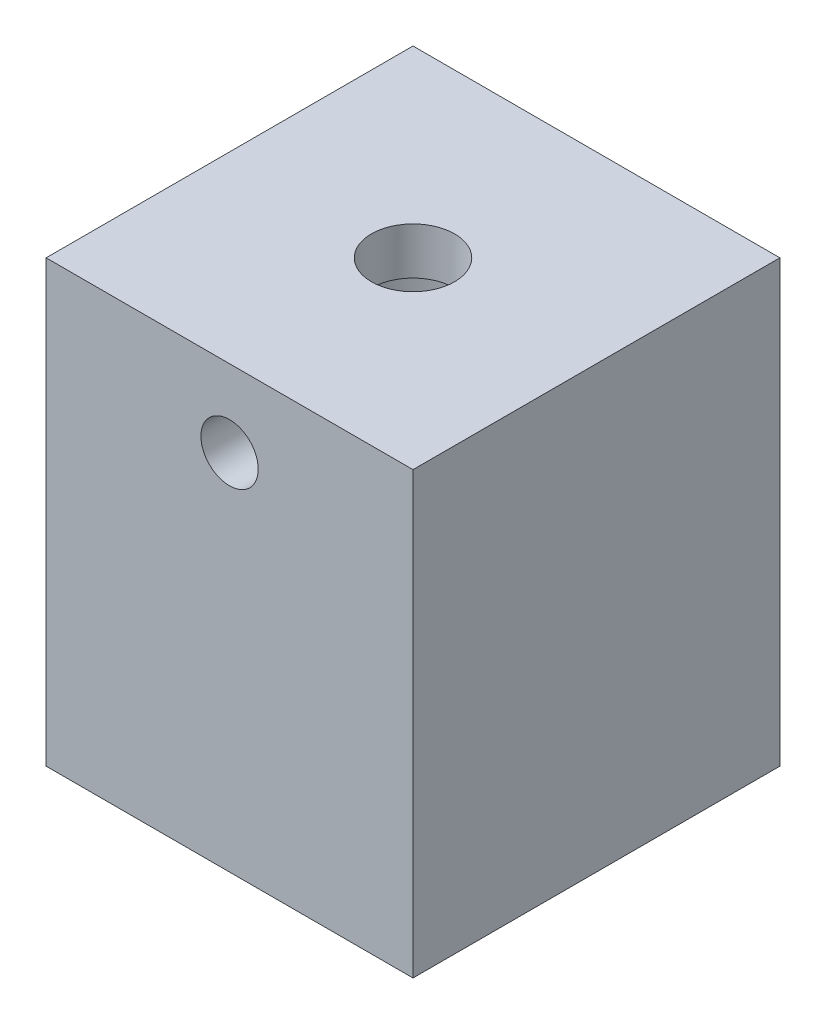
ISO-10303-21;
HEADER;
FILE_DESCRIPTION(('STEP AP214'),'2;1');
FILE_NAME('part.step','',(''),(''),'','','');
FILE_SCHEMA(('AUTOMOTIVE_DESIGN { 1 0 10303 214 1 1 1 1 }'));
ENDSEC;
DATA;
#1=APPLICATION_CONTEXT('core data for automotive mechanical design processes');
#2=APPLICATION_PROTOCOL_DEFINITION('international standard','automotive_design',2000,#1);
#3=PRODUCT_CONTEXT('',#1,'mechanical');
#4=PRODUCT('Part','Part','',(#3));
#5=PRODUCT_RELATED_PRODUCT_CATEGORY('part','',(#4));
#6=PRODUCT_DEFINITION_FORMATION('','',#4);
#7=PRODUCT_DEFINITION_CONTEXT('part definition',#1,'design');
#8=PRODUCT_DEFINITION('design','',#6,#7);
#9=PRODUCT_DEFINITION_SHAPE('','',#8);
#10=(LENGTH_UNIT() NAMED_UNIT(*) SI_UNIT(.MILLI.,.METRE.));
#11=(NAMED_UNIT(*) PLANE_ANGLE_UNIT() SI_UNIT($,.RADIAN.));
#12=(NAMED_UNIT(*) SI_UNIT($,.STERADIAN.) SOLID_ANGLE_UNIT());
#13=UNCERTAINTY_MEASURE_WITH_UNIT(LENGTH_MEASURE(1.E-05),#10,'distance_accuracy_value','');
#14=(GEOMETRIC_REPRESENTATION_CONTEXT(3) GLOBAL_UNCERTAINTY_ASSIGNED_CONTEXT((#13)) GLOBAL_UNIT_ASSIGNED_CONTEXT((#10,
#11,#12)) REPRESENTATION_CONTEXT('',''));
#15=CARTESIAN_POINT('',(0.,0.,0.));
#16=DIRECTION('',(0.,0.,1.));
#17=DIRECTION('',(1.,0.,0.));
#18=AXIS2_PLACEMENT_3D('',#15,#16,#17);
#19=CARTESIAN_POINT('',(25.4,60.96,25.4));
#20=DIRECTION('',(-1.,0.,0.));
#21=DIRECTION('',(0.,0.,1.));
#22=AXIS2_PLACEMENT_3D('',#19,#20,#21);
#23=PLANE('',#22);
#24=DIRECTION('',(0.,0.,-1.));
#25=VECTOR('',#24,1.);
#26=CARTESIAN_POINT('',(25.4,0.,25.4));
#27=LINE('',#26,#25);
#28=CARTESIAN_POINT('',(25.4,0.,25.4));
#29=VERTEX_POINT('',#28);
#30=CARTESIAN_POINT('',(25.4,0.,-25.4));
#31=VERTEX_POINT('',#30);
#32=EDGE_CURVE('E115',#29,#31,#27,.T.);
#33=ORIENTED_EDGE('',*,*,#32,.T.);
#34=DIRECTION('',(0.,-1.,0.));
#35=VECTOR('',#34,1.);
#36=CARTESIAN_POINT('',(25.4,60.96,-25.4));
#37=LINE('',#36,#35);
#38=CARTESIAN_POINT('',(25.4,60.96,-25.4));
#39=VERTEX_POINT('',#38);
#40=EDGE_CURVE('E103',#39,#31,#37,.T.);
#41=ORIENTED_EDGE('',*,*,#40,.F.);
#42=DIRECTION('',(0.,0.,-1.));
#43=VECTOR('',#42,1.);
#44=CARTESIAN_POINT('',(25.4,60.96,25.4));
#45=LINE('',#44,#43);
#46=CARTESIAN_POINT('',(25.4,60.96,25.4));
#47=VERTEX_POINT('',#46);
#48=EDGE_CURVE('E121',#47,#39,#45,.T.);
#49=ORIENTED_EDGE('',*,*,#48,.F.);
#50=DIRECTION('',(0.,-1.,0.));
#51=VECTOR('',#50,1.);
#52=CARTESIAN_POINT('',(25.4,60.96,25.4));
#53=LINE('',#52,#51);
#54=EDGE_CURVE('E131',#47,#29,#53,.T.);
#55=ORIENTED_EDGE('',*,*,#54,.T.);
#56=EDGE_LOOP('',(#33,#41,#49,#55));
#57=FACE_BOUND('',#56,.T.);
#58=ADVANCED_FACE('F33',(#57),#23,.F.);
#59=CARTESIAN_POINT('',(-25.4,60.96,-25.4));
#60=DIRECTION('',(0.,0.,1.));
#61=DIRECTION('',(1.,0.,0.));
#62=AXIS2_PLACEMENT_3D('',#59,#60,#61);
#63=PLANE('',#62);
#64=CARTESIAN_POINT('',(0.,50.292,-25.4));
#65=DIRECTION('',(0.,0.,1.));
#66=DIRECTION('',(1.,0.,0.));
#67=AXIS2_PLACEMENT_3D('',#64,#65,#66);
#68=CIRCLE('',#67,3.96874999999999);
#69=CARTESIAN_POINT('',(3.96874999999999,50.292,-25.4));
#70=VERTEX_POINT('',#69);
#71=EDGE_CURVE('E110',#70,#70,#68,.T.);
#72=ORIENTED_EDGE('',*,*,#71,.T.);
#73=EDGE_LOOP('',(#72));
#74=FACE_BOUND('',#73,.T.);
#75=DIRECTION('',(-1.,0.,0.));
#76=VECTOR('',#75,1.);
#77=CARTESIAN_POINT('',(-25.4,0.,-25.4));
#78=LINE('',#77,#76);
#79=CARTESIAN_POINT('',(-25.4,0.,-25.4));
#80=VERTEX_POINT('',#79);
#81=EDGE_CURVE('E134',#31,#80,#78,.T.);
#82=ORIENTED_EDGE('',*,*,#81,.T.);
#83=DIRECTION('',(0.,-1.,0.));
#84=VECTOR('',#83,1.);
#85=CARTESIAN_POINT('',(-25.4,60.96,-25.4));
#86=LINE('',#85,#84);
#87=CARTESIAN_POINT('',(-25.4,60.96,-25.4));
#88=VERTEX_POINT('',#87);
#89=EDGE_CURVE('E144',#88,#80,#86,.T.);
#90=ORIENTED_EDGE('',*,*,#89,.F.);
#91=DIRECTION('',(-1.,0.,0.));
#92=VECTOR('',#91,1.);
#93=CARTESIAN_POINT('',(-25.4,60.96,-25.4));
#94=LINE('',#93,#92);
#95=EDGE_CURVE('E124',#39,#88,#94,.T.);
#96=ORIENTED_EDGE('',*,*,#95,.F.);
#97=ORIENTED_EDGE('',*,*,#40,.T.);
#98=EDGE_LOOP('',(#82,#90,#96,#97));
#99=FACE_BOUND('',#98,.T.);
#100=ADVANCED_FACE('F214',(#74,#99),#63,.F.);
#101=CARTESIAN_POINT('',(-25.4,60.96,25.4));
#102=DIRECTION('',(1.,0.,0.));
#103=DIRECTION('',(0.,0.,-1.));
#104=AXIS2_PLACEMENT_3D('',#101,#102,#103);
#105=PLANE('',#104);
#106=DIRECTION('',(0.,0.,1.));
#107=VECTOR('',#106,1.);
#108=CARTESIAN_POINT('',(-25.4,0.,25.4));
#109=LINE('',#108,#107);
#110=CARTESIAN_POINT('',(-25.4,0.,25.4));
#111=VERTEX_POINT('',#110);
#112=EDGE_CURVE('E136',#80,#111,#109,.T.);
#113=ORIENTED_EDGE('',*,*,#112,.T.);
#114=DIRECTION('',(0.,-1.,0.));
#115=VECTOR('',#114,1.);
#116=CARTESIAN_POINT('',(-25.4,60.96,25.4));
#117=LINE('',#116,#115);
#118=CARTESIAN_POINT('',(-25.4,60.96,25.4));
#119=VERTEX_POINT('',#118);
#120=EDGE_CURVE('E141',#119,#111,#117,.T.);
#121=ORIENTED_EDGE('',*,*,#120,.F.);
#122=DIRECTION('',(0.,0.,1.));
#123=VECTOR('',#122,1.);
#124=CARTESIAN_POINT('',(-25.4,60.96,25.4));
#125=LINE('',#124,#123);
#126=EDGE_CURVE('E127',#88,#119,#125,.T.);
#127=ORIENTED_EDGE('',*,*,#126,.F.);
#128=ORIENTED_EDGE('',*,*,#89,.T.);
#129=EDGE_LOOP('',(#113,#121,#127,#128));
#130=FACE_BOUND('',#129,.T.);
#131=ADVANCED_FACE('F219',(#130),#105,.F.);
#132=CARTESIAN_POINT('',(-25.4,60.96,25.4));
#133=DIRECTION('',(0.,0.,-1.));
#134=DIRECTION('',(-1.,0.,0.));
#135=AXIS2_PLACEMENT_3D('',#132,#133,#134);
#136=PLANE('',#135);
#137=CARTESIAN_POINT('',(0.,50.292,25.4));
#138=DIRECTION('',(0.,0.,1.));
#139=DIRECTION('',(1.,0.,0.));
#140=AXIS2_PLACEMENT_3D('',#137,#138,#139);
#141=CIRCLE('',#140,3.96874999999999);
#142=CARTESIAN_POINT('',(3.96874999999999,50.292,25.4));
#143=VERTEX_POINT('',#142);
#144=EDGE_CURVE('E415',#143,#143,#141,.T.);
#145=ORIENTED_EDGE('',*,*,#144,.F.);
#146=EDGE_LOOP('',(#145));
#147=FACE_BOUND('',#146,.T.);
#148=DIRECTION('',(1.,0.,0.));
#149=VECTOR('',#148,1.);
#150=CARTESIAN_POINT('',(-25.4,0.,25.4));
#151=LINE('',#150,#149);
#152=EDGE_CURVE('E125',#111,#29,#151,.T.);
#153=ORIENTED_EDGE('',*,*,#152,.T.);
#154=ORIENTED_EDGE('',*,*,#54,.F.);
#155=DIRECTION('',(1.,0.,0.));
#156=VECTOR('',#155,1.);
#157=CARTESIAN_POINT('',(-25.4,60.96,25.4));
#158=LINE('',#157,#156);
#159=EDGE_CURVE('E129',#119,#47,#158,.T.);
#160=ORIENTED_EDGE('',*,*,#159,.F.);
#161=ORIENTED_EDGE('',*,*,#120,.T.);
#162=EDGE_LOOP('',(#153,#154,#160,#161));
#163=FACE_BOUND('',#162,.T.);
#164=ADVANCED_FACE('F237',(#147,#163),#136,.F.);
#165=CARTESIAN_POINT('',(0.,60.96,0.));
#166=DIRECTION('',(0.,-1.,0.));
#167=DIRECTION('',(0.,0.,-1.));
#168=AXIS2_PLACEMENT_3D('',#165,#166,#167);
#169=PLANE('',#168);
#170=CARTESIAN_POINT('',(0.,60.96,0.));
#171=DIRECTION('',(0.,1.,0.));
#172=DIRECTION('',(0.,0.,1.));
#173=AXIS2_PLACEMENT_3D('',#170,#171,#172);
#174=CIRCLE('',#173,5.75436999999999);
#175=CARTESIAN_POINT('',(0.,60.96,5.75436999999999));
#176=VERTEX_POINT('',#175);
#177=EDGE_CURVE('E255',#176,#176,#174,.T.);
#178=ORIENTED_EDGE('',*,*,#177,.F.);
#179=EDGE_LOOP('',(#178));
#180=FACE_BOUND('',#179,.T.);
#181=ORIENTED_EDGE('',*,*,#48,.T.);
#182=ORIENTED_EDGE('',*,*,#95,.T.);
#183=ORIENTED_EDGE('',*,*,#126,.T.);
#184=ORIENTED_EDGE('',*,*,#159,.T.);
#185=EDGE_LOOP('',(#181,#182,#183,#184));
#186=FACE_BOUND('',#185,.T.);
#187=ADVANCED_FACE('F233',(#180,#186),#169,.F.);
#188=CARTESIAN_POINT('',(0.,0.,0.));
#189=DIRECTION('',(0.,-1.,0.));
#190=DIRECTION('',(0.,0.,-1.));
#191=AXIS2_PLACEMENT_3D('',#188,#189,#190);
#192=PLANE('',#191);
#193=CARTESIAN_POINT('',(-11.1125,0.,-12.7));
#194=DIRECTION('',(0.,-1.,0.));
#195=DIRECTION('',(0.,0.,-1.));
#196=AXIS2_PLACEMENT_3D('',#193,#194,#195);
#197=CIRCLE('',#196,2.01929999999999);
#198=CARTESIAN_POINT('',(-11.1125,0.,-14.7193));
#199=VERTEX_POINT('',#198);
#200=EDGE_CURVE('E279',#199,#199,#197,.T.);
#201=ORIENTED_EDGE('',*,*,#200,.F.);
#202=EDGE_LOOP('',(#201));
#203=FACE_BOUND('',#202,.T.);
#204=CARTESIAN_POINT('',(-11.1125,0.,12.7));
#205=DIRECTION('',(0.,-1.,0.));
#206=DIRECTION('',(0.,0.,-1.));
#207=AXIS2_PLACEMENT_3D('',#204,#205,#206);
#208=CIRCLE('',#207,2.01929999999999);
#209=CARTESIAN_POINT('',(-11.1125,0.,10.6807));
#210=VERTEX_POINT('',#209);
#211=EDGE_CURVE('E274',#210,#210,#208,.T.);
#212=ORIENTED_EDGE('',*,*,#211,.F.);
#213=EDGE_LOOP('',(#212));
#214=FACE_BOUND('',#213,.T.);
#215=CARTESIAN_POINT('',(11.1125,0.,12.7));
#216=DIRECTION('',(0.,-1.,0.));
#217=DIRECTION('',(0.,0.,-1.));
#218=AXIS2_PLACEMENT_3D('',#215,#216,#217);
#219=CIRCLE('',#218,2.01929999999999);
#220=CARTESIAN_POINT('',(11.1125,0.,10.6807));
#221=VERTEX_POINT('',#220);
#222=EDGE_CURVE('E268',#221,#221,#219,.T.);
#223=ORIENTED_EDGE('',*,*,#222,.F.);
#224=EDGE_LOOP('',(#223));
#225=FACE_BOUND('',#224,.T.);
#226=CARTESIAN_POINT('',(11.1125,0.,-12.7));
#227=DIRECTION('',(0.,-1.,0.));
#228=DIRECTION('',(0.,0.,-1.));
#229=AXIS2_PLACEMENT_3D('',#226,#227,#228);
#230=CIRCLE('',#229,2.01929999999999);
#231=CARTESIAN_POINT('',(11.1125,0.,-14.7193));
#232=VERTEX_POINT('',#231);
#233=EDGE_CURVE('E260',#232,#232,#230,.T.);
#234=ORIENTED_EDGE('',*,*,#233,.F.);
#235=EDGE_LOOP('',(#234));
#236=FACE_BOUND('',#235,.T.);
#237=CARTESIAN_POINT('',(0.,0.,0.));
#238=DIRECTION('',(0.,-1.,0.));
#239=DIRECTION('',(0.,0.,-1.));
#240=AXIS2_PLACEMENT_3D('',#237,#238,#239);
#241=CIRCLE('',#240,12.7);
#242=CARTESIAN_POINT('',(0.,0.,-12.7));
#243=VERTEX_POINT('',#242);
#244=EDGE_CURVE('E113',#243,#243,#241,.T.);
#245=ORIENTED_EDGE('',*,*,#244,.F.);
#246=EDGE_LOOP('',(#245));
#247=FACE_BOUND('',#246,.T.);
#248=ORIENTED_EDGE('',*,*,#32,.F.);
#249=ORIENTED_EDGE('',*,*,#152,.F.);
#250=ORIENTED_EDGE('',*,*,#112,.F.);
#251=ORIENTED_EDGE('',*,*,#81,.F.);
#252=EDGE_LOOP('',(#248,#249,#250,#251));
#253=FACE_BOUND('',#252,.T.);
#254=ADVANCED_FACE('F227',(#203,#214,#225,#236,#247,#253),#192,.T.);
#255=CARTESIAN_POINT('',(0.,50.292,0.));
#256=DIRECTION('',(0.,-1.,0.));
#257=DIRECTION('',(0.,0.,-1.));
#258=AXIS2_PLACEMENT_3D('',#255,#256,#257);
#259=CONICAL_SURFACE('',#258,12.7,1.02974425867665);
#260=CARTESIAN_POINT('',(0.,54.4653555413364,0.));
#261=DIRECTION('',(0.,-1.,0.));
#262=DIRECTION('',(0.,0.,-1.));
#263=AXIS2_PLACEMENT_3D('',#260,#261,#262);
#264=CIRCLE('',#263,5.75436999999999);
#265=CARTESIAN_POINT('',(0.,54.4653555413364,-5.75436999999999));
#266=VERTEX_POINT('',#265);
#267=EDGE_CURVE('E117',#266,#266,#264,.F.);
#268=ORIENTED_EDGE('',*,*,#267,.T.);
#269=EDGE_LOOP('',(#268));
#270=FACE_BOUND('',#269,.T.);
#271=CARTESIAN_POINT('',(0.,50.292,0.));
#272=DIRECTION('',(0.,-1.,0.));
#273=DIRECTION('',(0.,0.,-1.));
#274=AXIS2_PLACEMENT_3D('',#271,#272,#273);
#275=CIRCLE('',#274,12.7);
#276=CARTESIAN_POINT('',(3.96874999999999,50.292,-12.0639555468967));
#277=VERTEX_POINT('',#276);
#278=CARTESIAN_POINT('',(3.96874999999999,50.292,12.0639555468967));
#279=VERTEX_POINT('',#278);
#280=EDGE_CURVE('E109',#277,#279,#275,.T.);
#281=ORIENTED_EDGE('',*,*,#280,.T.);
#282=CARTESIAN_POINT('',(3.94883628514464,49.894925,12.7639664048924));
#283=CARTESIAN_POINT('',(3.95704233854003,49.9766283391096,12.6190921472765));
#284=CARTESIAN_POINT('',(3.96273305232948,50.0586002005149,12.4742260014029));
#285=CARTESIAN_POINT('',(3.96900729334688,50.2230732493231,12.1846664993387));
#286=CARTESIAN_POINT('',(3.96959034894227,50.3055744849036,12.0399731603382));
#287=CARTESIAN_POINT('',(3.96556608988072,50.4712948265477,11.7505735596341));
#288=CARTESIAN_POINT('',(3.96094551507083,50.554515227912,11.6058682087685));
#289=CARTESIAN_POINT('',(3.94633597236228,50.7214426675684,11.3170297900787));
#290=CARTESIAN_POINT('',(3.93634715744419,50.8051496919256,11.1728967060644));
#291=CARTESIAN_POINT('',(3.8978641180265,51.0581140420668,10.7397357951668));
#292=CARTESIAN_POINT('',(3.86087391258643,51.2281466235524,10.4518163712067));
#293=CARTESIAN_POINT('',(3.78642356584844,51.4844094764402,10.0242506931538));
#294=CARTESIAN_POINT('',(3.75846247526701,51.5699946869619,9.88250936619769));
#295=CARTESIAN_POINT('',(3.69568616819484,51.7415636071791,9.60080387620265));
#296=CARTESIAN_POINT('',(3.66087212925969,51.8275472459368,9.46083941223413));
#297=CARTESIAN_POINT('',(3.59145008696303,51.9826094542477,9.21095004638842));
#298=CARTESIAN_POINT('',(3.55819247798826,52.0516309156736,9.10061399537424));
#299=CARTESIAN_POINT('',(3.48645303458538,52.1898102465421,8.88173215676473));
#300=CARTESIAN_POINT('',(3.44797131005224,52.258968113085,8.7731863315639));
#301=CARTESIAN_POINT('',(3.36526997821334,52.3973346015012,8.55826245660241));
#302=CARTESIAN_POINT('',(3.32104830855833,52.4665432326838,8.4518852019766));
#303=CARTESIAN_POINT('',(3.22628269076621,52.6048126743286,8.24186790546426));
#304=CARTESIAN_POINT('',(3.17573873128274,52.6738734845255,8.13822786849051));
#305=CARTESIAN_POINT('',(3.06709298285161,52.8122647453319,7.93334350581451));
#306=CARTESIAN_POINT('',(3.00892083436861,52.8815910141222,7.83213338913221));
#307=CARTESIAN_POINT('',(2.88459442614926,53.0193991237014,7.63407114199705));
#308=CARTESIAN_POINT('',(2.81843897364228,53.0878808366179,7.53721966573575));
#309=CARTESIAN_POINT('',(2.67742081971113,53.223197950405,7.34922032909033));
#310=CARTESIAN_POINT('',(2.60257716092711,53.2900365767328,7.25806064407259));
#311=CARTESIAN_POINT('',(2.44328124485515,53.421215597494,7.0826692216773));
#312=CARTESIAN_POINT('',(2.35883436377927,53.4855573629568,6.99843365300898));
#313=CARTESIAN_POINT('',(2.15057933506497,53.6306969134269,6.81254145227254));
#314=CARTESIAN_POINT('',(2.02287414542864,53.7100867349559,6.71406156555027));
#315=CARTESIAN_POINT('',(1.74899372075326,53.8579607482302,6.53612822835958));
#316=CARTESIAN_POINT('',(1.60283238401295,53.9264530594723,6.45666058983212));
#317=CARTESIAN_POINT('',(1.37091301791575,54.0173977688502,6.3540446526888));
#318=CARTESIAN_POINT('',(1.29110831241618,54.0458473165039,6.32250039667145));
#319=CARTESIAN_POINT('',(1.12792699930229,54.098058398723,6.26537562378885));
#320=CARTESIAN_POINT('',(1.04455198918184,54.1218220038288,6.23979247202567));
#321=CARTESIAN_POINT('',(0.874828184823184,54.1641184008049,6.19476177322681));
#322=CARTESIAN_POINT('',(0.788478304829996,54.182649259664,6.17531649325006));
#323=CARTESIAN_POINT('',(0.613626298537877,54.2140333096179,6.14265508363138));
#324=CARTESIAN_POINT('',(0.525124357131082,54.2268869866564,6.12943842083871));
#325=CARTESIAN_POINT('',(0.276170935282333,54.2543767332619,6.10127800997394));
#326=CARTESIAN_POINT('',(0.114101491877311,54.2624021580508,6.09321502867283));
#327=CARTESIAN_POINT('',(-0.209420579164375,54.2585254901593,6.09714647707043));
#328=CARTESIAN_POINT('',(-0.370873410494866,54.2466306758595,6.10913358094385));
#329=CARTESIAN_POINT('',(-0.683654708329883,54.2045098662324,6.1524841757384));
#330=CARTESIAN_POINT('',(-0.835141634694572,54.1748461523568,6.18325385545074));
#331=CARTESIAN_POINT('',(-1.12897111456779,54.0998083951002,6.26332871100689));
#332=CARTESIAN_POINT('',(-1.27131534181142,54.0544372370228,6.31263048282963));
#333=CARTESIAN_POINT('',(-1.54722302355871,53.9497893613394,6.43004659972505));
#334=CARTESIAN_POINT('',(-1.68047054544273,53.890187942373,6.49860806167932));
#335=CARTESIAN_POINT('',(-1.93236098722186,53.7614392847548,6.65162631661468));
#336=CARTESIAN_POINT('',(-2.05099760980771,53.6922879571343,6.73608992404938));
#337=CARTESIAN_POINT('',(-2.24968311928991,53.563207094879,6.89849910096364));
#338=CARTESIAN_POINT('',(-2.33256283825521,53.5044606548889,6.97398641312537));
#339=CARTESIAN_POINT('',(-2.4896657006432,53.384300892645,7.13162172905757));
#340=CARTESIAN_POINT('',(-2.56388422288159,53.3228861704912,7.21377324925415));
#341=CARTESIAN_POINT('',(-2.7044037170754,53.198204742245,7.38366377414711));
#342=CARTESIAN_POINT('',(-2.77068525658367,53.1349339446077,7.47141571738843));
#343=CARTESIAN_POINT('',(-2.89586228356881,53.0073162494771,7.65132141856965));
#344=CARTESIAN_POINT('',(-2.95475477358171,52.9429689271971,7.74347694208073));
#345=CARTESIAN_POINT('',(-3.10868808724779,52.7638167467123,8.00375552168105));
#346=CARTESIAN_POINT('',(-3.1965888944838,52.6483618409066,8.17566577618443));
#347=CARTESIAN_POINT('',(-3.35482436108315,52.4170319800995,8.52714469872437));
#348=CARTESIAN_POINT('',(-3.42514420373382,52.3011567537329,8.70671967816467));
#349=CARTESIAN_POINT('',(-3.55100574895055,52.0692978203227,9.0718539990412));
#350=CARTESIAN_POINT('',(-3.60649229556731,51.9533152745595,9.25743287618371));
#351=CARTESIAN_POINT('',(-3.70430967079463,51.7219758575651,9.6324167680831));
#352=CARTESIAN_POINT('',(-3.74663733100608,51.6066191435812,9.82182269264352));
#353=CARTESIAN_POINT('',(-3.82639648140534,51.3551068129763,10.2391555082607));
#354=CARTESIAN_POINT('',(-3.8614166801206,51.2191125152234,10.46763816694));
#355=CARTESIAN_POINT('',(-3.91654390829951,50.9483126737288,10.9271421040404));
#356=CARTESIAN_POINT('',(-3.93664640605989,50.813507503499,11.1581641322611));
#357=CARTESIAN_POINT('',(-3.96275307333856,50.5472799438854,11.6180733701455));
#358=CARTESIAN_POINT('',(-3.96897452593738,50.4158377300268,11.8469368108015));
#359=CARTESIAN_POINT('',(-3.96862868444069,50.2196989025599,12.1906569268917));
#360=CARTESIAN_POINT('',(-3.96690270914563,50.1545128089448,12.3052607074138));
#361=CARTESIAN_POINT('',(-3.96025742717998,50.0244706195757,12.5345616995513));
#362=CARTESIAN_POINT('',(-3.9553381481629,49.9596145209689,12.649258910349));
#363=CARTESIAN_POINT('',(-3.94883628514464,49.894925,12.7639664048924));
#364=B_SPLINE_CURVE_WITH_KNOTS('',3,(#282,#283,#284,#285,#286,#287,#288,#289,#290,#291,#292,
#293,#294,#295,#296,#297,#298,#299,#300,#301,#302,#303,#304,#305,#306,#307,#308,#309,#310,#311,
#312,#313,#314,#315,#316,#317,#318,#319,#320,#321,#322,#323,#324,#325,#326,#327,#328,#329,#330,
#331,#332,#333,#334,#335,#336,#337,#338,#339,#340,#341,#342,#343,#344,#345,#346,#347,#348,#349,
#350,#351,#352,#353,#354,#355,#356,#357,#358,#359,#360,#361,#362,#363),.UNSPECIFIED.,.F.,.F.,(4,
2,2,2,2,2,2,2,2,2,2,2,2,2,2,2,2,2,2,2,2,2,2,2,2,2,2,2,2,2,2,2,2,2,2,2,2,2,2,2,4),(0.,
0.499562622400708,0.999171373087047,1.50005613838536,2.00092663055593,3.00911721593991,
3.51276778065051,4.01633187752135,4.41921839921494,4.82209644706468,5.2251196508622,
5.62814357795964,6.0351876282392,6.44229256968731,6.84852149973018,7.25452411823908,
7.79183592150546,8.32874549152846,8.59963166374634,8.87039787208837,9.14126397280702,
9.41210688399582,9.89686825021268,10.381452534819,10.8514575468968,11.3213762694306,
11.8032621997491,12.2853551017933,12.664524152596,13.0438945930631,13.4241756522471,
13.8046104820068,14.4783763698776,15.1527081878369,15.8295136150677,16.5064818776451,
17.3105503741472,18.1148630309173,18.9064945568244,19.3020319445592,19.6975659070462),.UNSPECIFIED.);
#365=CARTESIAN_POINT('',(-3.96874999999999,50.292,12.0639555468967));
#366=VERTEX_POINT('',#365);
#367=EDGE_CURVE('E11',#279,#366,#364,.T.);
#368=ORIENTED_EDGE('',*,*,#367,.T.);
#369=CARTESIAN_POINT('',(-3.96874999999999,50.292,-12.0639555468967));
#370=VERTEX_POINT('',#369);
#371=EDGE_CURVE('E108',#366,#370,#275,.T.);
#372=ORIENTED_EDGE('',*,*,#371,.T.);
#373=CARTESIAN_POINT('',(-3.94883628514464,49.894925,-12.7639664048924));
#374=CARTESIAN_POINT('',(-3.95704233854003,49.9766283391096,-12.6190921472765));
#375=CARTESIAN_POINT('',(-3.96273305232948,50.0586002005149,-12.4742260014029));
#376=CARTESIAN_POINT('',(-3.96900729334688,50.2230732493231,-12.1846664993387));
#377=CARTESIAN_POINT('',(-3.96959034894227,50.3055744849036,-12.0399731603382));
#378=CARTESIAN_POINT('',(-3.96556608988072,50.4712948265477,-11.7505735596341));
#379=CARTESIAN_POINT('',(-3.96094551507083,50.554515227912,-11.6058682087685));
#380=CARTESIAN_POINT('',(-3.94633597236228,50.7214426675684,-11.3170297900787));
#381=CARTESIAN_POINT('',(-3.93634715744419,50.8051496919256,-11.1728967060644));
#382=CARTESIAN_POINT('',(-3.8978641180265,51.0581140420668,-10.7397357951668));
#383=CARTESIAN_POINT('',(-3.86087391258643,51.2281466235524,-10.4518163712067));
#384=CARTESIAN_POINT('',(-3.78642356584844,51.4844094764402,-10.0242506931538));
#385=CARTESIAN_POINT('',(-3.75846247526701,51.5699946869619,-9.88250936619769));
#386=CARTESIAN_POINT('',(-3.69568616819484,51.7415636071791,-9.60080387620265));
#387=CARTESIAN_POINT('',(-3.66087212925969,51.8275472459368,-9.46083941223413));
#388=CARTESIAN_POINT('',(-3.59145008696303,51.9826094542477,-9.21095004638842));
#389=CARTESIAN_POINT('',(-3.55819247798826,52.0516309156736,-9.10061399537424));
#390=CARTESIAN_POINT('',(-3.48645303458538,52.1898102465421,-8.88173215676473));
#391=CARTESIAN_POINT('',(-3.44797131005224,52.258968113085,-8.7731863315639));
#392=CARTESIAN_POINT('',(-3.36526997821334,52.3973346015012,-8.55826245660241));
#393=CARTESIAN_POINT('',(-3.32104830855833,52.4665432326838,-8.4518852019766));
#394=CARTESIAN_POINT('',(-3.22628269076621,52.6048126743286,-8.24186790546426));
#395=CARTESIAN_POINT('',(-3.17573873128274,52.6738734845255,-8.13822786849051));
#396=CARTESIAN_POINT('',(-3.06709298285161,52.8122647453319,-7.93334350581451));
#397=CARTESIAN_POINT('',(-3.00892083436861,52.8815910141222,-7.83213338913221));
#398=CARTESIAN_POINT('',(-2.88459442614926,53.0193991237014,-7.63407114199705));
#399=CARTESIAN_POINT('',(-2.81843897364228,53.0878808366179,-7.53721966573575));
#400=CARTESIAN_POINT('',(-2.67742081971113,53.223197950405,-7.34922032909033));
#401=CARTESIAN_POINT('',(-2.60257716092711,53.2900365767328,-7.25806064407259));
#402=CARTESIAN_POINT('',(-2.44328124485515,53.421215597494,-7.0826692216773));
#403=CARTESIAN_POINT('',(-2.35883436377927,53.4855573629568,-6.99843365300898));
#404=CARTESIAN_POINT('',(-2.15057933506497,53.6306969134269,-6.81254145227254));
#405=CARTESIAN_POINT('',(-2.02287414542864,53.7100867349559,-6.71406156555027));
#406=CARTESIAN_POINT('',(-1.74899372075326,53.8579607482302,-6.53612822835958));
#407=CARTESIAN_POINT('',(-1.60283238401295,53.9264530594723,-6.45666058983212));
#408=CARTESIAN_POINT('',(-1.37091301791575,54.0173977688502,-6.3540446526888));
#409=CARTESIAN_POINT('',(-1.29110831241618,54.0458473165039,-6.32250039667145));
#410=CARTESIAN_POINT('',(-1.12792699930229,54.098058398723,-6.26537562378885));
#411=CARTESIAN_POINT('',(-1.04455198918184,54.1218220038288,-6.23979247202567));
#412=CARTESIAN_POINT('',(-0.874828184823184,54.1641184008049,-6.19476177322681));
#413=CARTESIAN_POINT('',(-0.788478304829996,54.182649259664,-6.17531649325006));
#414=CARTESIAN_POINT('',(-0.613626298537877,54.2140333096179,-6.14265508363138));
#415=CARTESIAN_POINT('',(-0.525124357131082,54.2268869866564,-6.12943842083871));
#416=CARTESIAN_POINT('',(-0.276170935282333,54.2543767332619,-6.10127800997394));
#417=CARTESIAN_POINT('',(-0.114101491877311,54.2624021580508,-6.09321502867283));
#418=CARTESIAN_POINT('',(0.209420579164375,54.2585254901593,-6.09714647707043));
#419=CARTESIAN_POINT('',(0.370873410494866,54.2466306758595,-6.10913358094385));
#420=CARTESIAN_POINT('',(0.683654708329883,54.2045098662324,-6.1524841757384));
#421=CARTESIAN_POINT('',(0.835141634694572,54.1748461523568,-6.18325385545074));
#422=CARTESIAN_POINT('',(1.12897111456779,54.0998083951002,-6.26332871100689));
#423=CARTESIAN_POINT('',(1.27131534181142,54.0544372370228,-6.31263048282963));
#424=CARTESIAN_POINT('',(1.54722302355871,53.9497893613394,-6.43004659972505));
#425=CARTESIAN_POINT('',(1.68047054544273,53.890187942373,-6.49860806167932));
#426=CARTESIAN_POINT('',(1.93236098722186,53.7614392847548,-6.65162631661468));
#427=CARTESIAN_POINT('',(2.05099760980771,53.6922879571343,-6.73608992404938));
#428=CARTESIAN_POINT('',(2.24968311928991,53.563207094879,-6.89849910096364));
#429=CARTESIAN_POINT('',(2.33256283825521,53.5044606548889,-6.97398641312537));
#430=CARTESIAN_POINT('',(2.4896657006432,53.384300892645,-7.13162172905757));
#431=CARTESIAN_POINT('',(2.56388422288159,53.3228861704912,-7.21377324925415));
#432=CARTESIAN_POINT('',(2.7044037170754,53.198204742245,-7.38366377414711));
#433=CARTESIAN_POINT('',(2.77068525658367,53.1349339446077,-7.47141571738843));
#434=CARTESIAN_POINT('',(2.89586228356881,53.0073162494771,-7.65132141856965));
#435=CARTESIAN_POINT('',(2.95475477358171,52.9429689271971,-7.74347694208073));
#436=CARTESIAN_POINT('',(3.10868808724779,52.7638167467123,-8.00375552168105));
#437=CARTESIAN_POINT('',(3.1965888944838,52.6483618409066,-8.17566577618443));
#438=CARTESIAN_POINT('',(3.35482436108315,52.4170319800995,-8.52714469872437));
#439=CARTESIAN_POINT('',(3.42514420373382,52.3011567537329,-8.70671967816467));
#440=CARTESIAN_POINT('',(3.55100574895055,52.0692978203227,-9.0718539990412));
#441=CARTESIAN_POINT('',(3.60649229556731,51.9533152745595,-9.25743287618371));
#442=CARTESIAN_POINT('',(3.70430967079463,51.7219758575651,-9.6324167680831));
#443=CARTESIAN_POINT('',(3.74663733100608,51.6066191435812,-9.82182269264352));
#444=CARTESIAN_POINT('',(3.82639648140534,51.3551068129763,-10.2391555082607));
#445=CARTESIAN_POINT('',(3.8614166801206,51.2191125152234,-10.46763816694));
#446=CARTESIAN_POINT('',(3.91654390829951,50.9483126737288,-10.9271421040404));
#447=CARTESIAN_POINT('',(3.93664640605989,50.813507503499,-11.1581641322611));
#448=CARTESIAN_POINT('',(3.96275307333856,50.5472799438854,-11.6180733701455));
#449=CARTESIAN_POINT('',(3.96897452593738,50.4158377300268,-11.8469368108015));
#450=CARTESIAN_POINT('',(3.96862868444069,50.2196989025599,-12.1906569268917));
#451=CARTESIAN_POINT('',(3.96690270914563,50.1545128089448,-12.3052607074138));
#452=CARTESIAN_POINT('',(3.96025742717998,50.0244706195757,-12.5345616995513));
#453=CARTESIAN_POINT('',(3.9553381481629,49.9596145209689,-12.649258910349));
#454=CARTESIAN_POINT('',(3.94883628514464,49.894925,-12.7639664048924));
#455=B_SPLINE_CURVE_WITH_KNOTS('',3,(#373,#374,#375,#376,#377,#378,#379,#380,#381,#382,#383,
#384,#385,#386,#387,#388,#389,#390,#391,#392,#393,#394,#395,#396,#397,#398,#399,#400,#401,#402,
#403,#404,#405,#406,#407,#408,#409,#410,#411,#412,#413,#414,#415,#416,#417,#418,#419,#420,#421,
#422,#423,#424,#425,#426,#427,#428,#429,#430,#431,#432,#433,#434,#435,#436,#437,#438,#439,#440,
#441,#442,#443,#444,#445,#446,#447,#448,#449,#450,#451,#452,#453,#454),.UNSPECIFIED.,.F.,.F.,(4,
2,2,2,2,2,2,2,2,2,2,2,2,2,2,2,2,2,2,2,2,2,2,2,2,2,2,2,2,2,2,2,2,2,2,2,2,2,2,2,4),(0.,
0.499562622400708,0.999171373087047,1.50005613838536,2.00092663055593,3.00911721593991,
3.51276778065051,4.01633187752135,4.41921839921494,4.82209644706468,5.2251196508622,
5.62814357795964,6.0351876282392,6.44229256968731,6.84852149973018,7.25452411823908,
7.79183592150546,8.32874549152846,8.59963166374634,8.87039787208837,9.14126397280702,
9.41210688399582,9.89686825021268,10.381452534819,10.8514575468968,11.3213762694306,
11.8032621997491,12.2853551017933,12.664524152596,13.0438945930631,13.4241756522471,
13.8046104820068,14.4783763698776,15.1527081878369,15.8295136150677,16.5064818776451,
17.3105503741472,18.1148630309173,18.9064945568244,19.3020319445592,19.6975659070462),.UNSPECIFIED.);
#456=EDGE_CURVE('E45',#370,#277,#455,.T.);
#457=ORIENTED_EDGE('',*,*,#456,.T.);
#458=EDGE_LOOP('',(#281,#368,#372,#457));
#459=FACE_BOUND('',#458,.T.);
#460=ADVANCED_FACE('F112',(#270,#459),#259,.F.);
#461=CARTESIAN_POINT('',(0.,0.,0.));
#462=DIRECTION('',(0.,-1.,0.));
#463=DIRECTION('',(0.,0.,-1.));
#464=AXIS2_PLACEMENT_3D('',#461,#462,#463);
#465=CYLINDRICAL_SURFACE('',#464,12.7);
#466=ORIENTED_EDGE('',*,*,#280,.F.);
#467=CARTESIAN_POINT('',(3.96874999999999,50.292,-12.0639555468967));
#468=CARTESIAN_POINT('',(3.96876384278745,50.183310160773,-12.0639396011321));
#469=CARTESIAN_POINT('',(3.96428533993438,50.0746293717045,-12.0654240345969));
#470=CARTESIAN_POINT('',(3.94645139016717,49.8581021342129,-12.0712750854193));
#471=CARTESIAN_POINT('',(3.93309808267988,49.7502554910415,-12.0756410081418));
#472=CARTESIAN_POINT('',(3.89766976666564,49.5364468525561,-12.0871211475398));
#473=CARTESIAN_POINT('',(3.87561825482686,49.430480577029,-12.0942279590388));
#474=CARTESIAN_POINT('',(3.82301340458844,49.2209106100942,-12.1109588938083));
#475=CARTESIAN_POINT('',(3.79245981347099,49.1173069890137,-12.1205830919056));
#476=CARTESIAN_POINT('',(3.68843213626673,48.8111994049534,-12.1528105123193));
#477=CARTESIAN_POINT('',(3.60254287719169,48.6131107078037,-12.1787852067018));
#478=CARTESIAN_POINT('',(3.40035917233074,48.2341434829746,-12.2367705480838));
#479=CARTESIAN_POINT('',(3.28404893008728,48.0532739633084,-12.2687843285361));
#480=CARTESIAN_POINT('',(3.02005187915319,47.7076294128097,-12.3364656765925));
#481=CARTESIAN_POINT('',(2.8715052525242,47.5435259052234,-12.372215671617));
#482=CARTESIAN_POINT('',(2.54909205628162,47.2421095776029,-12.44264126579));
#483=CARTESIAN_POINT('',(2.37522113922475,47.1048013670302,-12.477316679222));
#484=CARTESIAN_POINT('',(2.00223364123091,46.8578830680382,-12.5426334599043));
#485=CARTESIAN_POINT('',(1.80263495049442,46.748969798944,-12.5731658295551));
#486=CARTESIAN_POINT('',(1.38684469913986,46.5665278909578,-12.6257869190337));
#487=CARTESIAN_POINT('',(1.17065772156933,46.4929895191372,-12.6478779610351));
#488=CARTESIAN_POINT('',(0.734901533601003,46.3856357528766,-12.6805426666129));
#489=CARTESIAN_POINT('',(0.515642623141847,46.3506644550035,-12.6914507430905));
#490=CARTESIAN_POINT('',(0.0741116027482467,46.3177751597199,-12.7017016797783));
#491=CARTESIAN_POINT('',(-0.148159873815067,46.3198494908655,-12.7010469344288));
#492=CARTESIAN_POINT('',(-0.581262679886928,46.3602333979334,-12.6884784061732));
#493=CARTESIAN_POINT('',(-0.79222401962424,46.3972893057539,-12.6769541759622));
#494=CARTESIAN_POINT('',(-1.20476586302444,46.5045275631428,-12.6444208146599));
#495=CARTESIAN_POINT('',(-1.40634586171065,46.5747116936691,-12.62341117364));
#496=CARTESIAN_POINT('',(-1.79729874768687,46.7470176835363,-12.5737447751084));
#497=CARTESIAN_POINT('',(-1.98649184224217,46.8495202586616,-12.5449974906739));
#498=CARTESIAN_POINT('',(-2.3453832594279,47.0832569695372,-12.4828841244105));
#499=CARTESIAN_POINT('',(-2.51507684200122,47.2144980687852,-12.449516923873));
#500=CARTESIAN_POINT('',(-2.83759826115083,47.508370948599,-12.3800806744172));
#501=CARTESIAN_POINT('',(-2.98943129366098,47.6720811464285,-12.3439569714155));
#502=CARTESIAN_POINT('',(-3.26385951934676,48.0231296151861,-12.2742548662548));
#503=CARTESIAN_POINT('',(-3.38644590229341,48.2104749800291,-12.2406772331438));
#504=CARTESIAN_POINT('',(-3.54624220332649,48.5065096842629,-12.1949693301785));
#505=CARTESIAN_POINT('',(-3.59572791356957,48.6083817145075,-12.1804331894173));
#506=CARTESIAN_POINT('',(-3.68589299212506,48.8162032679907,-12.1534525871179));
#507=CARTESIAN_POINT('',(-3.72657598598602,48.9221510912871,-12.1410072649144));
#508=CARTESIAN_POINT('',(-3.79873860004679,49.1372604998815,-12.1186225833987));
#509=CARTESIAN_POINT('',(-3.83022801011117,49.246418529369,-12.108680559992));
#510=CARTESIAN_POINT('',(-3.88375773896479,49.4671991252397,-12.0916174519875));
#511=CARTESIAN_POINT('',(-3.90580239946279,49.5788205343508,-12.0844950713274));
#512=CARTESIAN_POINT('',(-3.93823199836256,49.7905986061726,-12.0739636027755));
#513=CARTESIAN_POINT('',(-3.94967521994164,49.8905779144533,-12.0702188596898));
#514=CARTESIAN_POINT('',(-3.96493384671194,50.0910355541136,-12.0652107712999));
#515=CARTESIAN_POINT('',(-3.96876002366037,50.1915129790599,-12.0639439218898));
#516=CARTESIAN_POINT('',(-3.96874999999999,50.292,-12.0639555468967));
#517=B_SPLINE_CURVE_WITH_KNOTS('',3,(#467,#468,#469,#470,#471,#472,#473,#474,#475,#476,#477,
#478,#479,#480,#481,#482,#483,#484,#485,#486,#487,#488,#489,#490,#491,#492,#493,#494,#495,#496,
#497,#498,#499,#500,#501,#502,#503,#504,#505,#506,#507,#508,#509,#510,#511,#512,#513,#514,#515,
#516),.UNSPECIFIED.,.F.,.F.,(4,2,2,2,2,2,2,2,2,2,2,2,2,2,2,2,2,2,2,2,2,2,2,2,4),(0.,
0.325951786307935,0.651825024724479,0.976823936324334,1.30183250930079,1.95098317176942,
2.60047158497595,3.27006507849053,3.93977365749381,4.62463167809554,5.30930116126774,
5.97284007347965,6.63624158101656,7.27673598346188,7.91726482251137,8.56564036479014,
9.2141731861108,9.88967501100965,10.5653800671395,10.9075766962829,11.249632116505,
11.5913219564357,11.9328545541146,12.2346445935806,12.5360075481333),.UNSPECIFIED.);
#518=EDGE_CURVE('E57',#277,#370,#517,.T.);
#519=ORIENTED_EDGE('',*,*,#518,.T.);
#520=ORIENTED_EDGE('',*,*,#371,.F.);
#521=CARTESIAN_POINT('',(-3.96874999999999,50.292,12.0639555468967));
#522=CARTESIAN_POINT('',(-3.96876384278745,50.183310160773,12.0639396011321));
#523=CARTESIAN_POINT('',(-3.96428533993438,50.0746293717045,12.0654240345969));
#524=CARTESIAN_POINT('',(-3.94645139016717,49.8581021342129,12.0712750854193));
#525=CARTESIAN_POINT('',(-3.93309808267988,49.7502554910415,12.0756410081418));
#526=CARTESIAN_POINT('',(-3.89766976666564,49.5364468525561,12.0871211475398));
#527=CARTESIAN_POINT('',(-3.87561825482686,49.430480577029,12.0942279590388));
#528=CARTESIAN_POINT('',(-3.82301340458844,49.2209106100942,12.1109588938083));
#529=CARTESIAN_POINT('',(-3.79245981347099,49.1173069890137,12.1205830919056));
#530=CARTESIAN_POINT('',(-3.68843213626673,48.8111994049534,12.1528105123193));
#531=CARTESIAN_POINT('',(-3.60254287719169,48.6131107078037,12.1787852067018));
#532=CARTESIAN_POINT('',(-3.40035917233074,48.2341434829746,12.2367705480838));
#533=CARTESIAN_POINT('',(-3.28404893008728,48.0532739633084,12.2687843285361));
#534=CARTESIAN_POINT('',(-3.02005187915319,47.7076294128097,12.3364656765925));
#535=CARTESIAN_POINT('',(-2.8715052525242,47.5435259052234,12.372215671617));
#536=CARTESIAN_POINT('',(-2.54909205628162,47.2421095776029,12.44264126579));
#537=CARTESIAN_POINT('',(-2.37522113922475,47.1048013670302,12.477316679222));
#538=CARTESIAN_POINT('',(-2.00223364123091,46.8578830680382,12.5426334599043));
#539=CARTESIAN_POINT('',(-1.80263495049442,46.748969798944,12.5731658295551));
#540=CARTESIAN_POINT('',(-1.38684469913986,46.5665278909578,12.6257869190337));
#541=CARTESIAN_POINT('',(-1.17065772156933,46.4929895191372,12.6478779610351));
#542=CARTESIAN_POINT('',(-0.734901533601003,46.3856357528766,12.6805426666129));
#543=CARTESIAN_POINT('',(-0.515642623141847,46.3506644550035,12.6914507430905));
#544=CARTESIAN_POINT('',(-0.0741116027482467,46.3177751597199,12.7017016797783));
#545=CARTESIAN_POINT('',(0.148159873815067,46.3198494908655,12.7010469344288));
#546=CARTESIAN_POINT('',(0.581262679886928,46.3602333979334,12.6884784061732));
#547=CARTESIAN_POINT('',(0.79222401962424,46.3972893057539,12.6769541759622));
#548=CARTESIAN_POINT('',(1.20476586302444,46.5045275631428,12.6444208146599));
#549=CARTESIAN_POINT('',(1.40634586171065,46.5747116936691,12.62341117364));
#550=CARTESIAN_POINT('',(1.79729874768687,46.7470176835363,12.5737447751084));
#551=CARTESIAN_POINT('',(1.98649184224217,46.8495202586616,12.5449974906739));
#552=CARTESIAN_POINT('',(2.3453832594279,47.0832569695372,12.4828841244105));
#553=CARTESIAN_POINT('',(2.51507684200122,47.2144980687852,12.449516923873));
#554=CARTESIAN_POINT('',(2.83759826115083,47.508370948599,12.3800806744172));
#555=CARTESIAN_POINT('',(2.98943129366098,47.6720811464285,12.3439569714155));
#556=CARTESIAN_POINT('',(3.26385951934676,48.0231296151861,12.2742548662548));
#557=CARTESIAN_POINT('',(3.38644590229341,48.2104749800291,12.2406772331438));
#558=CARTESIAN_POINT('',(3.54624220332649,48.5065096842629,12.1949693301785));
#559=CARTESIAN_POINT('',(3.59572791356957,48.6083817145075,12.1804331894173));
#560=CARTESIAN_POINT('',(3.68589299212506,48.8162032679907,12.1534525871179));
#561=CARTESIAN_POINT('',(3.72657598598602,48.9221510912871,12.1410072649144));
#562=CARTESIAN_POINT('',(3.79873860004679,49.1372604998815,12.1186225833987));
#563=CARTESIAN_POINT('',(3.83022801011117,49.246418529369,12.108680559992));
#564=CARTESIAN_POINT('',(3.88375773896479,49.4671991252397,12.0916174519875));
#565=CARTESIAN_POINT('',(3.90580239946279,49.5788205343508,12.0844950713274));
#566=CARTESIAN_POINT('',(3.93823199836256,49.7905986061726,12.0739636027755));
#567=CARTESIAN_POINT('',(3.94967521994164,49.8905779144533,12.0702188596898));
#568=CARTESIAN_POINT('',(3.96493384671194,50.0910355541136,12.0652107712999));
#569=CARTESIAN_POINT('',(3.96876002366037,50.1915129790599,12.0639439218898));
#570=CARTESIAN_POINT('',(3.96874999999999,50.292,12.0639555468967));
#571=B_SPLINE_CURVE_WITH_KNOTS('',3,(#521,#522,#523,#524,#525,#526,#527,#528,#529,#530,#531,
#532,#533,#534,#535,#536,#537,#538,#539,#540,#541,#542,#543,#544,#545,#546,#547,#548,#549,#550,
#551,#552,#553,#554,#555,#556,#557,#558,#559,#560,#561,#562,#563,#564,#565,#566,#567,#568,#569,
#570),.UNSPECIFIED.,.F.,.F.,(4,2,2,2,2,2,2,2,2,2,2,2,2,2,2,2,2,2,2,2,2,2,2,2,4),(0.,
0.325951786307935,0.651825024724479,0.976823936324334,1.30183250930079,1.95098317176942,
2.60047158497595,3.27006507849053,3.93977365749381,4.62463167809554,5.30930116126774,
5.97284007347965,6.63624158101656,7.27673598346188,7.91726482251137,8.56564036479014,
9.2141731861108,9.88967501100965,10.5653800671395,10.9075766962829,11.249632116505,
11.5913219564357,11.9328545541146,12.2346445935806,12.5360075481333),.UNSPECIFIED.);
#572=EDGE_CURVE('E51',#366,#279,#571,.T.);
#573=ORIENTED_EDGE('',*,*,#572,.T.);
#574=EDGE_LOOP('',(#466,#519,#520,#573));
#575=FACE_BOUND('',#574,.T.);
#576=ORIENTED_EDGE('',*,*,#244,.T.);
#577=EDGE_LOOP('',(#576));
#578=FACE_BOUND('',#577,.T.);
#579=ADVANCED_FACE('F106',(#575,#578),#465,.F.);
#580=CARTESIAN_POINT('',(0.,60.96,0.));
#581=DIRECTION('',(0.,1.,0.));
#582=DIRECTION('',(0.,0.,1.));
#583=AXIS2_PLACEMENT_3D('',#580,#581,#582);
#584=CYLINDRICAL_SURFACE('',#583,5.75436999999999);
#585=ORIENTED_EDGE('',*,*,#177,.T.);
#586=EDGE_LOOP('',(#585));
#587=FACE_BOUND('',#586,.T.);
#588=ORIENTED_EDGE('',*,*,#267,.F.);
#589=EDGE_LOOP('',(#588));
#590=FACE_BOUND('',#589,.T.);
#591=ADVANCED_FACE('F177',(#587,#590),#584,.F.);
#592=CARTESIAN_POINT('',(11.1125,19.05,-12.7));
#593=DIRECTION('',(0.,-1.,0.));
#594=DIRECTION('',(0.,0.,-1.));
#595=AXIS2_PLACEMENT_3D('',#592,#593,#594);
#596=CONICAL_SURFACE('',#595,2.01929999999999,1.02974425867665);
#597=CARTESIAN_POINT('',(11.1125,20.2633178480024,-12.7));
#598=VERTEX_POINT('',#597);
#599=VERTEX_LOOP('',#598);
#600=FACE_BOUND('',#599,.T.);
#601=CARTESIAN_POINT('',(11.1125,19.05,-12.7));
#602=DIRECTION('',(0.,-1.,0.));
#603=DIRECTION('',(0.,0.,-1.));
#604=AXIS2_PLACEMENT_3D('',#601,#602,#603);
#605=CIRCLE('',#604,2.01929999999999);
#606=CARTESIAN_POINT('',(11.1125,19.05,-14.7193));
#607=VERTEX_POINT('',#606);
#608=EDGE_CURVE('E256',#607,#607,#605,.T.);
#609=ORIENTED_EDGE('',*,*,#608,.T.);
#610=EDGE_LOOP('',(#609));
#611=FACE_BOUND('',#610,.T.);
#612=ADVANCED_FACE('F181',(#600,#611),#596,.F.);
#613=CARTESIAN_POINT('',(11.1125,0.,-12.7));
#614=DIRECTION('',(0.,-1.,0.));
#615=DIRECTION('',(0.,0.,-1.));
#616=AXIS2_PLACEMENT_3D('',#613,#614,#615);
#617=CYLINDRICAL_SURFACE('',#616,2.01929999999999);
#618=ORIENTED_EDGE('',*,*,#608,.F.);
#619=EDGE_LOOP('',(#618));
#620=FACE_BOUND('',#619,.T.);
#621=ORIENTED_EDGE('',*,*,#233,.T.);
#622=EDGE_LOOP('',(#621));
#623=FACE_BOUND('',#622,.T.);
#624=ADVANCED_FACE('F185',(#620,#623),#617,.F.);
#625=CARTESIAN_POINT('',(11.1125,19.05,12.7));
#626=DIRECTION('',(0.,-1.,0.));
#627=DIRECTION('',(0.,0.,-1.));
#628=AXIS2_PLACEMENT_3D('',#625,#626,#627);
#629=CONICAL_SURFACE('',#628,2.01929999999999,1.02974425867665);
#630=CARTESIAN_POINT('',(11.1125,20.2633178480024,12.7));
#631=VERTEX_POINT('',#630);
#632=VERTEX_LOOP('',#631);
#633=FACE_BOUND('',#632,.T.);
#634=CARTESIAN_POINT('',(11.1125,19.05,12.7));
#635=DIRECTION('',(0.,-1.,0.));
#636=DIRECTION('',(0.,0.,-1.));
#637=AXIS2_PLACEMENT_3D('',#634,#635,#636);
#638=CIRCLE('',#637,2.01929999999999);
#639=CARTESIAN_POINT('',(11.1125,19.05,10.6807));
#640=VERTEX_POINT('',#639);
#641=EDGE_CURVE('E265',#640,#640,#638,.T.);
#642=ORIENTED_EDGE('',*,*,#641,.T.);
#643=EDGE_LOOP('',(#642));
#644=FACE_BOUND('',#643,.T.);
#645=ADVANCED_FACE('F189',(#633,#644),#629,.F.);
#646=CARTESIAN_POINT('',(11.1125,0.,12.7));
#647=DIRECTION('',(0.,-1.,0.));
#648=DIRECTION('',(0.,0.,-1.));
#649=AXIS2_PLACEMENT_3D('',#646,#647,#648);
#650=CYLINDRICAL_SURFACE('',#649,2.01929999999999);
#651=ORIENTED_EDGE('',*,*,#641,.F.);
#652=EDGE_LOOP('',(#651));
#653=FACE_BOUND('',#652,.T.);
#654=ORIENTED_EDGE('',*,*,#222,.T.);
#655=EDGE_LOOP('',(#654));
#656=FACE_BOUND('',#655,.T.);
#657=ADVANCED_FACE('F193',(#653,#656),#650,.F.);
#658=CARTESIAN_POINT('',(-11.1125,19.05,12.7));
#659=DIRECTION('',(0.,-1.,0.));
#660=DIRECTION('',(0.,0.,-1.));
#661=AXIS2_PLACEMENT_3D('',#658,#659,#660);
#662=CONICAL_SURFACE('',#661,2.01929999999999,1.02974425867665);
#663=CARTESIAN_POINT('',(-11.1125,20.2633178480024,12.7));
#664=VERTEX_POINT('',#663);
#665=VERTEX_LOOP('',#664);
#666=FACE_BOUND('',#665,.T.);
#667=CARTESIAN_POINT('',(-11.1125,19.05,12.7));
#668=DIRECTION('',(0.,-1.,0.));
#669=DIRECTION('',(0.,0.,-1.));
#670=AXIS2_PLACEMENT_3D('',#667,#668,#669);
#671=CIRCLE('',#670,2.01929999999999);
#672=CARTESIAN_POINT('',(-11.1125,19.05,10.6807));
#673=VERTEX_POINT('',#672);
#674=EDGE_CURVE('E271',#673,#673,#671,.T.);
#675=ORIENTED_EDGE('',*,*,#674,.T.);
#676=EDGE_LOOP('',(#675));
#677=FACE_BOUND('',#676,.T.);
#678=ADVANCED_FACE('F197',(#666,#677),#662,.F.);
#679=CARTESIAN_POINT('',(-11.1125,0.,12.7));
#680=DIRECTION('',(0.,-1.,0.));
#681=DIRECTION('',(0.,0.,-1.));
#682=AXIS2_PLACEMENT_3D('',#679,#680,#681);
#683=CYLINDRICAL_SURFACE('',#682,2.01929999999999);
#684=ORIENTED_EDGE('',*,*,#674,.F.);
#685=EDGE_LOOP('',(#684));
#686=FACE_BOUND('',#685,.T.);
#687=ORIENTED_EDGE('',*,*,#211,.T.);
#688=EDGE_LOOP('',(#687));
#689=FACE_BOUND('',#688,.T.);
#690=ADVANCED_FACE('F201',(#686,#689),#683,.F.);
#691=CARTESIAN_POINT('',(-11.1125,19.05,-12.7));
#692=DIRECTION('',(0.,-1.,0.));
#693=DIRECTION('',(0.,0.,-1.));
#694=AXIS2_PLACEMENT_3D('',#691,#692,#693);
#695=CONICAL_SURFACE('',#694,2.01929999999999,1.02974425867665);
#696=CARTESIAN_POINT('',(-11.1125,20.2633178480024,-12.7));
#697=VERTEX_POINT('',#696);
#698=VERTEX_LOOP('',#697);
#699=FACE_BOUND('',#698,.T.);
#700=CARTESIAN_POINT('',(-11.1125,19.05,-12.7));
#701=DIRECTION('',(0.,-1.,0.));
#702=DIRECTION('',(0.,0.,-1.));
#703=AXIS2_PLACEMENT_3D('',#700,#701,#702);
#704=CIRCLE('',#703,2.01929999999999);
#705=CARTESIAN_POINT('',(-11.1125,19.05,-14.7193));
#706=VERTEX_POINT('',#705);
#707=EDGE_CURVE('E277',#706,#706,#704,.T.);
#708=ORIENTED_EDGE('',*,*,#707,.T.);
#709=EDGE_LOOP('',(#708));
#710=FACE_BOUND('',#709,.T.);
#711=ADVANCED_FACE('F204',(#699,#710),#695,.F.);
#712=CARTESIAN_POINT('',(-11.1125,0.,-12.7));
#713=DIRECTION('',(0.,-1.,0.));
#714=DIRECTION('',(0.,0.,-1.));
#715=AXIS2_PLACEMENT_3D('',#712,#713,#714);
#716=CYLINDRICAL_SURFACE('',#715,2.01929999999999);
#717=ORIENTED_EDGE('',*,*,#707,.F.);
#718=EDGE_LOOP('',(#717));
#719=FACE_BOUND('',#718,.T.);
#720=ORIENTED_EDGE('',*,*,#200,.T.);
#721=EDGE_LOOP('',(#720));
#722=FACE_BOUND('',#721,.T.);
#723=ADVANCED_FACE('F159',(#719,#722),#716,.F.);
#724=CARTESIAN_POINT('',(0.,50.292,25.4));
#725=DIRECTION('',(0.,0.,1.));
#726=DIRECTION('',(1.,0.,0.));
#727=AXIS2_PLACEMENT_3D('',#724,#725,#726);
#728=CYLINDRICAL_SURFACE('',#727,3.96874999999999);
#729=ORIENTED_EDGE('',*,*,#71,.F.);
#730=EDGE_LOOP('',(#729));
#731=FACE_BOUND('',#730,.T.);
#732=ORIENTED_EDGE('',*,*,#456,.F.);
#733=ORIENTED_EDGE('',*,*,#518,.F.);
#734=EDGE_LOOP('',(#732,#733));
#735=FACE_BOUND('',#734,.T.);
#736=ADVANCED_FACE('F98',(#731,#735),#728,.F.);
#737=ORIENTED_EDGE('',*,*,#144,.T.);
#738=EDGE_LOOP('',(#737));
#739=FACE_BOUND('',#738,.T.);
#740=ORIENTED_EDGE('',*,*,#367,.F.);
#741=ORIENTED_EDGE('',*,*,#572,.F.);
#742=EDGE_LOOP('',(#740,#741));
#743=FACE_BOUND('',#742,.T.);
#744=ADVANCED_FACE('F154',(#739,#743),#728,.F.);
#745=CLOSED_SHELL('',(#58,#100,#131,#164,#187,#254,#460,#579,#591,#612,#624,#645,#657,#678,#690,
#711,#723,#736,#744));
#746=MANIFOLD_SOLID_BREP('B2',#745);
#747=ADVANCED_BREP_SHAPE_REPRESENTATION('',(#18,#746),#14);
#748=SHAPE_DEFINITION_REPRESENTATION(#9,#747);
ENDSEC;
END-ISO-10303-21;
